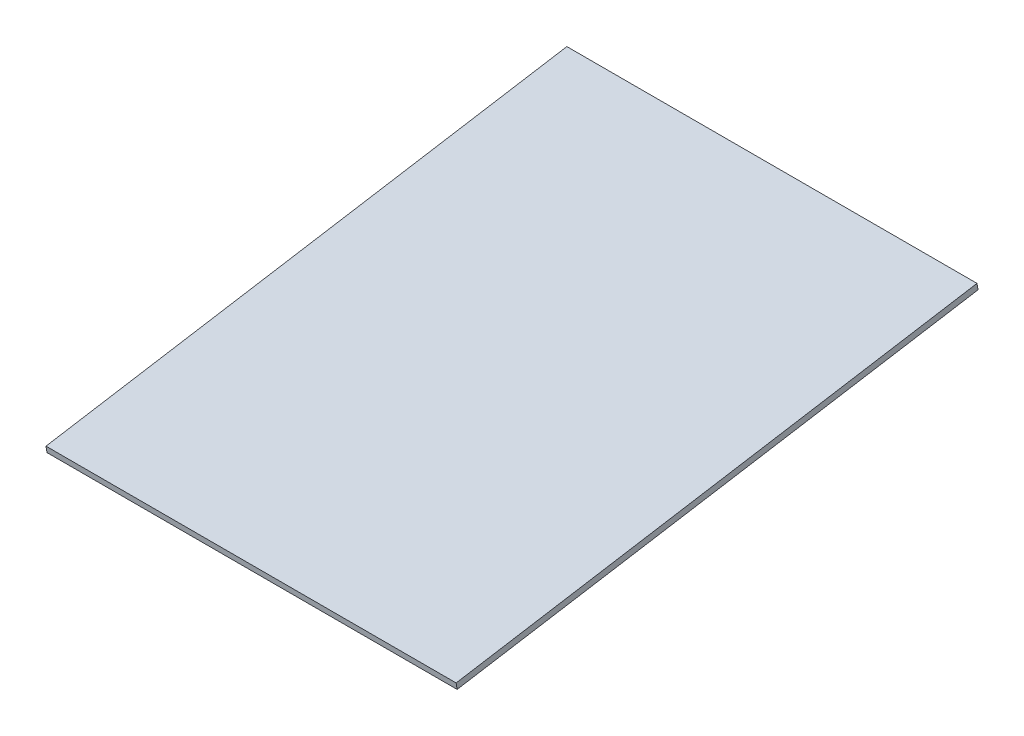
ISO-10303-21;
HEADER;
FILE_DESCRIPTION(('STEP AP214'),'2;1');
FILE_NAME('part.step','',(''),(''),'','','');
FILE_SCHEMA(('AUTOMOTIVE_DESIGN { 1 0 10303 214 1 1 1 1 }'));
ENDSEC;
DATA;
#1=APPLICATION_CONTEXT('core data for automotive mechanical design processes');
#2=APPLICATION_PROTOCOL_DEFINITION('international standard','automotive_design',2000,#1);
#3=PRODUCT_CONTEXT('',#1,'mechanical');
#4=PRODUCT('Part','Part','',(#3));
#5=PRODUCT_RELATED_PRODUCT_CATEGORY('part','',(#4));
#6=PRODUCT_DEFINITION_FORMATION('','',#4);
#7=PRODUCT_DEFINITION_CONTEXT('part definition',#1,'design');
#8=PRODUCT_DEFINITION('design','',#6,#7);
#9=PRODUCT_DEFINITION_SHAPE('','',#8);
#10=(LENGTH_UNIT() NAMED_UNIT(*) SI_UNIT(.MILLI.,.METRE.));
#11=(NAMED_UNIT(*) PLANE_ANGLE_UNIT() SI_UNIT($,.RADIAN.));
#12=(NAMED_UNIT(*) SI_UNIT($,.STERADIAN.) SOLID_ANGLE_UNIT());
#13=UNCERTAINTY_MEASURE_WITH_UNIT(LENGTH_MEASURE(1.E-05),#10,'distance_accuracy_value','');
#14=(GEOMETRIC_REPRESENTATION_CONTEXT(3) GLOBAL_UNCERTAINTY_ASSIGNED_CONTEXT((#13)) GLOBAL_UNIT_ASSIGNED_CONTEXT((#10,
#11,#12)) REPRESENTATION_CONTEXT('',''));
#15=CARTESIAN_POINT('',(0.,0.,0.));
#16=DIRECTION('',(0.,0.,1.));
#17=DIRECTION('',(1.,0.,0.));
#18=AXIS2_PLACEMENT_3D('',#15,#16,#17);
#19=CARTESIAN_POINT('',(100.,385.991920352572,1030.48019136995));
#20=DIRECTION('',(1.,0.,0.));
#21=DIRECTION('',(0.,0.,-1.));
#22=AXIS2_PLACEMENT_3D('',#19,#20,#21);
#23=PLANE('',#22);
#24=DIRECTION('',(0.,0.16217195826243,-0.98676251243819));
#25=VECTOR('',#24,1.);
#26=CARTESIAN_POINT('',(100.,389.124891329564,1030.99508733743));
#27=LINE('',#26,#25);
#28=CARTESIAN_POINT('',(99.9999999999999,345.366842675186,1297.24828235475));
#29=VERTEX_POINT('',#28);
#30=CARTESIAN_POINT('',(100.,389.124891329564,1030.99508733743));
#31=VERTEX_POINT('',#30);
#32=EDGE_CURVE('E105',#29,#31,#27,.T.);
#33=ORIENTED_EDGE('',*,*,#32,.F.);
#34=DIRECTION('',(0.,0.98676251243819,0.16217195826243));
#35=VECTOR('',#34,1.);
#36=CARTESIAN_POINT('',(99.9999999999999,342.233871698195,1296.73338638726));
#37=LINE('',#36,#35);
#38=CARTESIAN_POINT('',(99.9999999999999,342.233871698195,1296.73338638726));
#39=VERTEX_POINT('',#38);
#40=EDGE_CURVE('E11',#39,#29,#37,.T.);
#41=ORIENTED_EDGE('',*,*,#40,.F.);
#42=DIRECTION('',(0.,0.16217195826243,-0.98676251243819));
#43=VECTOR('',#42,1.);
#44=CARTESIAN_POINT('',(100.,385.991920352572,1030.48019136995));
#45=LINE('',#44,#43);
#46=CARTESIAN_POINT('',(100.,385.991920352572,1030.48019136995));
#47=VERTEX_POINT('',#46);
#48=EDGE_CURVE('E92',#39,#47,#45,.T.);
#49=ORIENTED_EDGE('',*,*,#48,.T.);
#50=DIRECTION('',(0.,0.98676251243819,0.16217195826243));
#51=VECTOR('',#50,1.);
#52=CARTESIAN_POINT('',(100.,385.991920352572,1030.48019136995));
#53=LINE('',#52,#51);
#54=EDGE_CURVE('E44',#47,#31,#53,.T.);
#55=ORIENTED_EDGE('',*,*,#54,.T.);
#56=EDGE_LOOP('',(#33,#41,#49,#55));
#57=FACE_BOUND('',#56,.T.);
#58=ADVANCED_FACE('F41',(#57),#23,.T.);
#59=CARTESIAN_POINT('',(99.9999999999999,342.233871698195,1296.73338638726));
#60=DIRECTION('',(0.,-0.16217195826243,0.98676251243819));
#61=DIRECTION('',(0.,-0.98676251243819,-0.16217195826243));
#62=AXIS2_PLACEMENT_3D('',#59,#60,#61);
#63=PLANE('',#62);
#64=DIRECTION('',(1.,0.,0.));
#65=VECTOR('',#64,1.);
#66=CARTESIAN_POINT('',(99.9999999999999,345.366842675186,1297.24828235475));
#67=LINE('',#66,#65);
#68=CARTESIAN_POINT('',(-109.652,345.366842675186,1297.24828235475));
#69=VERTEX_POINT('',#68);
#70=EDGE_CURVE('E72',#69,#29,#67,.T.);
#71=ORIENTED_EDGE('',*,*,#70,.F.);
#72=DIRECTION('',(0.,0.98676251243819,0.16217195826243));
#73=VECTOR('',#72,1.);
#74=CARTESIAN_POINT('',(-109.652,342.233871698195,1296.73338638726));
#75=LINE('',#74,#73);
#76=CARTESIAN_POINT('',(-109.652,342.233871698195,1296.73338638726));
#77=VERTEX_POINT('',#76);
#78=EDGE_CURVE('E50',#77,#69,#75,.T.);
#79=ORIENTED_EDGE('',*,*,#78,.F.);
#80=DIRECTION('',(1.,0.,0.));
#81=VECTOR('',#80,1.);
#82=CARTESIAN_POINT('',(-100.,342.233871698195,1296.73338638726));
#83=LINE('',#82,#81);
#84=EDGE_CURVE('E58',#77,#39,#83,.T.);
#85=ORIENTED_EDGE('',*,*,#84,.T.);
#86=ORIENTED_EDGE('',*,*,#40,.T.);
#87=EDGE_LOOP('',(#71,#79,#85,#86));
#88=FACE_BOUND('',#87,.T.);
#89=ADVANCED_FACE('F116',(#88),#63,.T.);
#90=CARTESIAN_POINT('',(-109.652,342.233871698195,1296.73338638726));
#91=DIRECTION('',(-1.,0.,0.));
#92=DIRECTION('',(0.,-1.,0.));
#93=AXIS2_PLACEMENT_3D('',#90,#91,#92);
#94=PLANE('',#93);
#95=DIRECTION('',(0.,-0.16217195826243,0.98676251243819));
#96=VECTOR('',#95,1.);
#97=CARTESIAN_POINT('',(-109.652,345.366842675186,1297.24828235475));
#98=LINE('',#97,#96);
#99=CARTESIAN_POINT('',(-109.652,389.124891329564,1030.99508733743));
#100=VERTEX_POINT('',#99);
#101=EDGE_CURVE('E98',#100,#69,#98,.T.);
#102=ORIENTED_EDGE('',*,*,#101,.F.);
#103=DIRECTION('',(0.,0.98676251243819,0.16217195826243));
#104=VECTOR('',#103,1.);
#105=CARTESIAN_POINT('',(-109.652,385.991920352572,1030.48019136995));
#106=LINE('',#105,#104);
#107=CARTESIAN_POINT('',(-109.652,385.991920352572,1030.48019136995));
#108=VERTEX_POINT('',#107);
#109=EDGE_CURVE('E85',#108,#100,#106,.T.);
#110=ORIENTED_EDGE('',*,*,#109,.F.);
#111=DIRECTION('',(0.,-0.16217195826243,0.98676251243819));
#112=VECTOR('',#111,1.);
#113=CARTESIAN_POINT('',(-109.652,342.233871698195,1296.73338638726));
#114=LINE('',#113,#112);
#115=EDGE_CURVE('E91',#108,#77,#114,.T.);
#116=ORIENTED_EDGE('',*,*,#115,.T.);
#117=ORIENTED_EDGE('',*,*,#78,.T.);
#118=EDGE_LOOP('',(#102,#110,#116,#117));
#119=FACE_BOUND('',#118,.T.);
#120=ADVANCED_FACE('F96',(#119),#94,.T.);
#121=CARTESIAN_POINT('',(-109.652,385.991920352572,1030.48019136995));
#122=DIRECTION('',(0.,0.16217195826243,-0.98676251243819));
#123=DIRECTION('',(0.,0.98676251243819,0.16217195826243));
#124=AXIS2_PLACEMENT_3D('',#121,#122,#123);
#125=PLANE('',#124);
#126=DIRECTION('',(-1.,0.,0.));
#127=VECTOR('',#126,1.);
#128=CARTESIAN_POINT('',(-109.652,389.124891329564,1030.99508733743));
#129=LINE('',#128,#127);
#130=EDGE_CURVE('E108',#31,#100,#129,.T.);
#131=ORIENTED_EDGE('',*,*,#130,.F.);
#132=ORIENTED_EDGE('',*,*,#54,.F.);
#133=DIRECTION('',(-1.,0.,0.));
#134=VECTOR('',#133,1.);
#135=CARTESIAN_POINT('',(100.,385.991920352572,1030.48019136995));
#136=LINE('',#135,#134);
#137=EDGE_CURVE('E82',#47,#108,#136,.T.);
#138=ORIENTED_EDGE('',*,*,#137,.T.);
#139=ORIENTED_EDGE('',*,*,#109,.T.);
#140=EDGE_LOOP('',(#131,#132,#138,#139));
#141=FACE_BOUND('',#140,.T.);
#142=ADVANCED_FACE('F84',(#141),#125,.T.);
#143=CARTESIAN_POINT('',(0.,540.743239619063,88.8698029980004));
#144=DIRECTION('',(0.,-0.98676251243819,-0.16217195826243));
#145=DIRECTION('',(0.,0.16217195826243,-0.98676251243819));
#146=AXIS2_PLACEMENT_3D('',#143,#144,#145);
#147=PLANE('',#146);
#148=ORIENTED_EDGE('',*,*,#48,.F.);
#149=ORIENTED_EDGE('',*,*,#84,.F.);
#150=ORIENTED_EDGE('',*,*,#115,.F.);
#151=ORIENTED_EDGE('',*,*,#137,.F.);
#152=EDGE_LOOP('',(#148,#149,#150,#151));
#153=FACE_BOUND('',#152,.T.);
#154=ADVANCED_FACE('F100',(#153),#147,.T.);
#155=CARTESIAN_POINT('',(0.,543.876210596054,89.3846989654836));
#156=DIRECTION('',(0.,-0.98676251243819,-0.16217195826243));
#157=DIRECTION('',(0.,0.16217195826243,-0.98676251243819));
#158=AXIS2_PLACEMENT_3D('',#155,#156,#157);
#159=PLANE('',#158);
#160=ORIENTED_EDGE('',*,*,#32,.T.);
#161=ORIENTED_EDGE('',*,*,#130,.T.);
#162=ORIENTED_EDGE('',*,*,#101,.T.);
#163=ORIENTED_EDGE('',*,*,#70,.T.);
#164=EDGE_LOOP('',(#160,#161,#162,#163));
#165=FACE_BOUND('',#164,.T.);
#166=ADVANCED_FACE('F113',(#165),#159,.F.);
#167=CLOSED_SHELL('',(#58,#89,#120,#142,#154,#166));
#168=MANIFOLD_SOLID_BREP('B2',#167);
#169=ADVANCED_BREP_SHAPE_REPRESENTATION('',(#18,#168),#14);
#170=SHAPE_DEFINITION_REPRESENTATION(#9,#169);
ENDSEC;
END-ISO-10303-21;
